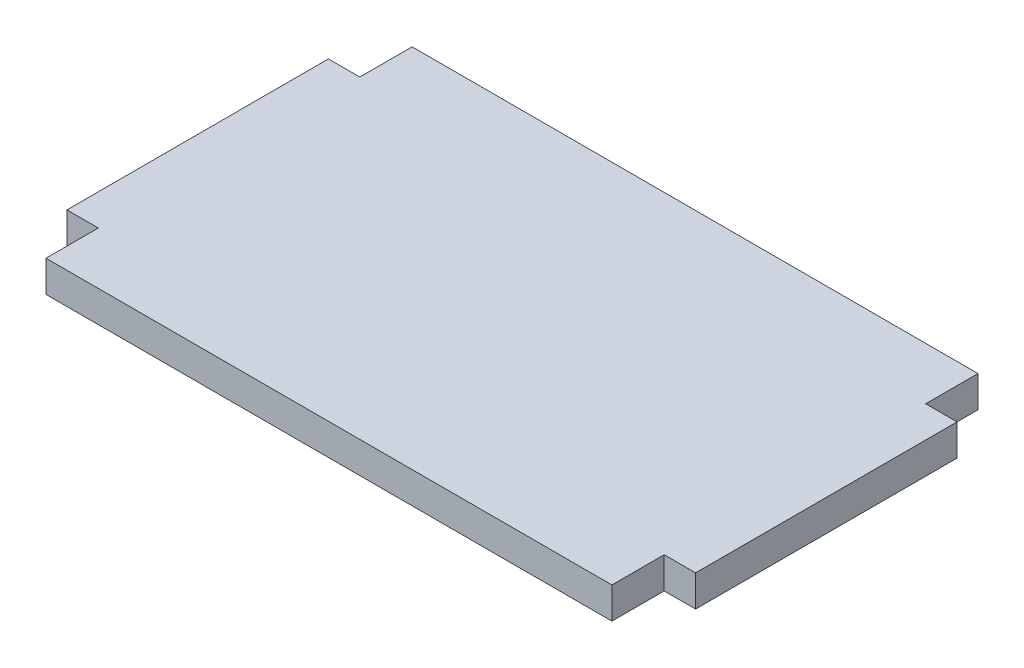
ISO-10303-21;
HEADER;
FILE_DESCRIPTION(('STEP AP214'),'2;1');
FILE_NAME('part.step','',(''),(''),'','','');
FILE_SCHEMA(('AUTOMOTIVE_DESIGN { 1 0 10303 214 1 1 1 1 }'));
ENDSEC;
DATA;
#1=APPLICATION_CONTEXT('core data for automotive mechanical design processes');
#2=APPLICATION_PROTOCOL_DEFINITION('international standard','automotive_design',2000,#1);
#3=PRODUCT_CONTEXT('',#1,'mechanical');
#4=PRODUCT('Part','Part','',(#3));
#5=PRODUCT_RELATED_PRODUCT_CATEGORY('part','',(#4));
#6=PRODUCT_DEFINITION_FORMATION('','',#4);
#7=PRODUCT_DEFINITION_CONTEXT('part definition',#1,'design');
#8=PRODUCT_DEFINITION('design','',#6,#7);
#9=PRODUCT_DEFINITION_SHAPE('','',#8);
#10=(LENGTH_UNIT() NAMED_UNIT(*) SI_UNIT(.MILLI.,.METRE.));
#11=(NAMED_UNIT(*) PLANE_ANGLE_UNIT() SI_UNIT($,.RADIAN.));
#12=(NAMED_UNIT(*) SI_UNIT($,.STERADIAN.) SOLID_ANGLE_UNIT());
#13=UNCERTAINTY_MEASURE_WITH_UNIT(LENGTH_MEASURE(1.E-05),#10,'distance_accuracy_value','');
#14=(GEOMETRIC_REPRESENTATION_CONTEXT(3) GLOBAL_UNCERTAINTY_ASSIGNED_CONTEXT((#13)) GLOBAL_UNIT_ASSIGNED_CONTEXT((#10,
#11,#12)) REPRESENTATION_CONTEXT('',''));
#15=CARTESIAN_POINT('',(0.,0.,0.));
#16=DIRECTION('',(0.,0.,1.));
#17=DIRECTION('',(1.,0.,0.));
#18=AXIS2_PLACEMENT_3D('',#15,#16,#17);
#19=CARTESIAN_POINT('',(0.,6.,0.));
#20=DIRECTION('',(0.,0.,-1.));
#21=DIRECTION('',(-1.,0.,0.));
#22=AXIS2_PLACEMENT_3D('',#19,#20,#21);
#23=PLANE('',#22);
#24=DIRECTION('',(0.,-1.,0.));
#25=VECTOR('',#24,1.);
#26=CARTESIAN_POINT('',(0.,6.,0.));
#27=LINE('',#26,#25);
#28=CARTESIAN_POINT('',(0.,6.,0.));
#29=VERTEX_POINT('',#28);
#30=CARTESIAN_POINT('',(0.,0.,0.));
#31=VERTEX_POINT('',#30);
#32=EDGE_CURVE('E59',#29,#31,#27,.T.);
#33=ORIENTED_EDGE('',*,*,#32,.F.);
#34=DIRECTION('',(1.,0.,0.));
#35=VECTOR('',#34,1.);
#36=CARTESIAN_POINT('',(0.,6.,0.));
#37=LINE('',#36,#35);
#38=CARTESIAN_POINT('',(-6.,6.,0.));
#39=VERTEX_POINT('',#38);
#40=EDGE_CURVE('E226',#39,#29,#37,.T.);
#41=ORIENTED_EDGE('',*,*,#40,.F.);
#42=DIRECTION('',(0.,1.,0.));
#43=VECTOR('',#42,1.);
#44=CARTESIAN_POINT('',(-6.,6.,0.));
#45=LINE('',#44,#43);
#46=CARTESIAN_POINT('',(-6.,0.,0.));
#47=VERTEX_POINT('',#46);
#48=EDGE_CURVE('E220',#47,#39,#45,.T.);
#49=ORIENTED_EDGE('',*,*,#48,.F.);
#50=DIRECTION('',(1.,0.,0.));
#51=VECTOR('',#50,1.);
#52=CARTESIAN_POINT('',(0.,0.,0.));
#53=LINE('',#52,#51);
#54=EDGE_CURVE('E204',#47,#31,#53,.T.);
#55=ORIENTED_EDGE('',*,*,#54,.T.);
#56=EDGE_LOOP('',(#33,#41,#49,#55));
#57=FACE_BOUND('',#56,.T.);
#58=ADVANCED_FACE('F42',(#57),#23,.F.);
#59=DIRECTION('',(0.,1.,0.));
#60=VECTOR('',#59,1.);
#61=CARTESIAN_POINT('',(108.2,6.,0.));
#62=LINE('',#61,#60);
#63=CARTESIAN_POINT('',(108.2,0.,0.));
#64=VERTEX_POINT('',#63);
#65=CARTESIAN_POINT('',(108.2,6.,0.));
#66=VERTEX_POINT('',#65);
#67=EDGE_CURVE('E67',#64,#66,#62,.T.);
#68=ORIENTED_EDGE('',*,*,#67,.F.);
#69=CARTESIAN_POINT('',(114.2,0.,0.));
#70=VERTEX_POINT('',#69);
#71=EDGE_CURVE('E208',#64,#70,#53,.T.);
#72=ORIENTED_EDGE('',*,*,#71,.T.);
#73=DIRECTION('',(0.,-1.,0.));
#74=VECTOR('',#73,1.);
#75=CARTESIAN_POINT('',(114.2,6.,0.));
#76=LINE('',#75,#74);
#77=CARTESIAN_POINT('',(114.2,6.,0.));
#78=VERTEX_POINT('',#77);
#79=EDGE_CURVE('E189',#78,#70,#76,.T.);
#80=ORIENTED_EDGE('',*,*,#79,.F.);
#81=EDGE_CURVE('E227',#66,#78,#37,.T.);
#82=ORIENTED_EDGE('',*,*,#81,.F.);
#83=EDGE_LOOP('',(#68,#72,#80,#82));
#84=FACE_BOUND('',#83,.T.);
#85=ADVANCED_FACE('F276',(#84),#23,.F.);
#86=CARTESIAN_POINT('',(0.,6.,-50.));
#87=DIRECTION('',(0.,0.,1.));
#88=DIRECTION('',(1.,0.,0.));
#89=AXIS2_PLACEMENT_3D('',#86,#87,#88);
#90=PLANE('',#89);
#91=DIRECTION('',(0.,-1.,0.));
#92=VECTOR('',#91,1.);
#93=CARTESIAN_POINT('',(108.2,6.,-50.));
#94=LINE('',#93,#92);
#95=CARTESIAN_POINT('',(108.2,6.,-50.));
#96=VERTEX_POINT('',#95);
#97=CARTESIAN_POINT('',(108.2,0.,-50.));
#98=VERTEX_POINT('',#97);
#99=EDGE_CURVE('E156',#96,#98,#94,.T.);
#100=ORIENTED_EDGE('',*,*,#99,.F.);
#101=DIRECTION('',(-1.,0.,0.));
#102=VECTOR('',#101,1.);
#103=CARTESIAN_POINT('',(0.,6.,-50.));
#104=LINE('',#103,#102);
#105=CARTESIAN_POINT('',(114.2,6.,-50.));
#106=VERTEX_POINT('',#105);
#107=EDGE_CURVE('E12',#106,#96,#104,.T.);
#108=ORIENTED_EDGE('',*,*,#107,.F.);
#109=DIRECTION('',(0.,1.,0.));
#110=VECTOR('',#109,1.);
#111=CARTESIAN_POINT('',(114.2,6.,-50.));
#112=LINE('',#111,#110);
#113=CARTESIAN_POINT('',(114.2,0.,-50.));
#114=VERTEX_POINT('',#113);
#115=EDGE_CURVE('E200',#114,#106,#112,.T.);
#116=ORIENTED_EDGE('',*,*,#115,.F.);
#117=DIRECTION('',(-1.,0.,0.));
#118=VECTOR('',#117,1.);
#119=CARTESIAN_POINT('',(0.,0.,-50.));
#120=LINE('',#119,#118);
#121=EDGE_CURVE('E45',#114,#98,#120,.T.);
#122=ORIENTED_EDGE('',*,*,#121,.T.);
#123=EDGE_LOOP('',(#100,#108,#116,#122));
#124=FACE_BOUND('',#123,.T.);
#125=ADVANCED_FACE('F300',(#124),#90,.F.);
#126=DIRECTION('',(0.,1.,0.));
#127=VECTOR('',#126,1.);
#128=CARTESIAN_POINT('',(0.,6.,-50.));
#129=LINE('',#128,#127);
#130=CARTESIAN_POINT('',(0.,0.,-50.));
#131=VERTEX_POINT('',#130);
#132=CARTESIAN_POINT('',(0.,6.,-50.));
#133=VERTEX_POINT('',#132);
#134=EDGE_CURVE('E158',#131,#133,#129,.T.);
#135=ORIENTED_EDGE('',*,*,#134,.F.);
#136=CARTESIAN_POINT('',(-6.,0.,-50.));
#137=VERTEX_POINT('',#136);
#138=EDGE_CURVE('E207',#131,#137,#120,.T.);
#139=ORIENTED_EDGE('',*,*,#138,.T.);
#140=DIRECTION('',(0.,-1.,0.));
#141=VECTOR('',#140,1.);
#142=CARTESIAN_POINT('',(-6.,6.,-50.));
#143=LINE('',#142,#141);
#144=CARTESIAN_POINT('',(-6.,6.,-50.));
#145=VERTEX_POINT('',#144);
#146=EDGE_CURVE('E221',#145,#137,#143,.T.);
#147=ORIENTED_EDGE('',*,*,#146,.F.);
#148=EDGE_CURVE('E51',#133,#145,#104,.T.);
#149=ORIENTED_EDGE('',*,*,#148,.F.);
#150=EDGE_LOOP('',(#135,#139,#147,#149));
#151=FACE_BOUND('',#150,.T.);
#152=ADVANCED_FACE('F242',(#151),#90,.F.);
#153=CARTESIAN_POINT('',(0.,6.,0.));
#154=DIRECTION('',(0.,-1.,0.));
#155=DIRECTION('',(0.,0.,-1.));
#156=AXIS2_PLACEMENT_3D('',#153,#154,#155);
#157=PLANE('',#156);
#158=ORIENTED_EDGE('',*,*,#107,.T.);
#159=DIRECTION('',(0.,0.,1.));
#160=VECTOR('',#159,1.);
#161=CARTESIAN_POINT('',(108.2,6.,-60.));
#162=LINE('',#161,#160);
#163=CARTESIAN_POINT('',(108.2,6.,-60.));
#164=VERTEX_POINT('',#163);
#165=EDGE_CURVE('E260',#164,#96,#162,.T.);
#166=ORIENTED_EDGE('',*,*,#165,.F.);
#167=DIRECTION('',(1.,0.,0.));
#168=VECTOR('',#167,1.);
#169=CARTESIAN_POINT('',(108.2,6.,-60.));
#170=LINE('',#169,#168);
#171=CARTESIAN_POINT('',(0.,6.,-60.));
#172=VERTEX_POINT('',#171);
#173=EDGE_CURVE('E266',#172,#164,#170,.T.);
#174=ORIENTED_EDGE('',*,*,#173,.F.);
#175=DIRECTION('',(0.,0.,1.));
#176=VECTOR('',#175,1.);
#177=CARTESIAN_POINT('',(0.,6.,-60.));
#178=LINE('',#177,#176);
#179=EDGE_CURVE('E265',#172,#133,#178,.T.);
#180=ORIENTED_EDGE('',*,*,#179,.T.);
#181=ORIENTED_EDGE('',*,*,#148,.T.);
#182=DIRECTION('',(0.,0.,-1.));
#183=VECTOR('',#182,1.);
#184=CARTESIAN_POINT('',(-6.,6.,-50.));
#185=LINE('',#184,#183);
#186=EDGE_CURVE('E224',#39,#145,#185,.T.);
#187=ORIENTED_EDGE('',*,*,#186,.F.);
#188=ORIENTED_EDGE('',*,*,#40,.T.);
#189=DIRECTION('',(0.,0.,-1.));
#190=VECTOR('',#189,1.);
#191=CARTESIAN_POINT('',(0.,6.,10.));
#192=LINE('',#191,#190);
#193=CARTESIAN_POINT('',(0.,6.,10.));
#194=VERTEX_POINT('',#193);
#195=EDGE_CURVE('E282',#194,#29,#192,.T.);
#196=ORIENTED_EDGE('',*,*,#195,.F.);
#197=DIRECTION('',(-1.,0.,0.));
#198=VECTOR('',#197,1.);
#199=CARTESIAN_POINT('',(0.,6.,10.));
#200=LINE('',#199,#198);
#201=CARTESIAN_POINT('',(108.2,6.,10.));
#202=VERTEX_POINT('',#201);
#203=EDGE_CURVE('E149',#202,#194,#200,.T.);
#204=ORIENTED_EDGE('',*,*,#203,.F.);
#205=DIRECTION('',(0.,0.,-1.));
#206=VECTOR('',#205,1.);
#207=CARTESIAN_POINT('',(108.2,6.,10.));
#208=LINE('',#207,#206);
#209=EDGE_CURVE('E161',#202,#66,#208,.T.);
#210=ORIENTED_EDGE('',*,*,#209,.T.);
#211=ORIENTED_EDGE('',*,*,#81,.T.);
#212=DIRECTION('',(0.,0.,1.));
#213=VECTOR('',#212,1.);
#214=CARTESIAN_POINT('',(114.2,6.,0.));
#215=LINE('',#214,#213);
#216=EDGE_CURVE('E250',#106,#78,#215,.T.);
#217=ORIENTED_EDGE('',*,*,#216,.F.);
#218=EDGE_LOOP('',(#158,#166,#174,#180,#181,#187,#188,#196,#204,#210,#211,#217));
#219=FACE_BOUND('',#218,.T.);
#220=ADVANCED_FACE('F256',(#219),#157,.F.);
#221=CARTESIAN_POINT('',(0.,0.,0.));
#222=DIRECTION('',(0.,-1.,0.));
#223=DIRECTION('',(0.,0.,-1.));
#224=AXIS2_PLACEMENT_3D('',#221,#222,#223);
#225=PLANE('',#224);
#226=ORIENTED_EDGE('',*,*,#54,.F.);
#227=DIRECTION('',(0.,0.,1.));
#228=VECTOR('',#227,1.);
#229=CARTESIAN_POINT('',(-6.,0.,-50.));
#230=LINE('',#229,#228);
#231=EDGE_CURVE('E214',#137,#47,#230,.T.);
#232=ORIENTED_EDGE('',*,*,#231,.F.);
#233=ORIENTED_EDGE('',*,*,#138,.F.);
#234=DIRECTION('',(0.,0.,1.));
#235=VECTOR('',#234,1.);
#236=CARTESIAN_POINT('',(0.,0.,-60.));
#237=LINE('',#236,#235);
#238=CARTESIAN_POINT('',(0.,0.,-60.));
#239=VERTEX_POINT('',#238);
#240=EDGE_CURVE('E190',#239,#131,#237,.T.);
#241=ORIENTED_EDGE('',*,*,#240,.F.);
#242=DIRECTION('',(-1.,0.,0.));
#243=VECTOR('',#242,1.);
#244=CARTESIAN_POINT('',(108.2,0.,-60.));
#245=LINE('',#244,#243);
#246=CARTESIAN_POINT('',(108.2,0.,-60.));
#247=VERTEX_POINT('',#246);
#248=EDGE_CURVE('E170',#247,#239,#245,.T.);
#249=ORIENTED_EDGE('',*,*,#248,.F.);
#250=DIRECTION('',(0.,0.,1.));
#251=VECTOR('',#250,1.);
#252=CARTESIAN_POINT('',(108.2,0.,-60.));
#253=LINE('',#252,#251);
#254=EDGE_CURVE('E184',#247,#98,#253,.T.);
#255=ORIENTED_EDGE('',*,*,#254,.T.);
#256=ORIENTED_EDGE('',*,*,#121,.F.);
#257=DIRECTION('',(0.,0.,-1.));
#258=VECTOR('',#257,1.);
#259=CARTESIAN_POINT('',(114.2,0.,0.));
#260=LINE('',#259,#258);
#261=EDGE_CURVE('E195',#70,#114,#260,.T.);
#262=ORIENTED_EDGE('',*,*,#261,.F.);
#263=ORIENTED_EDGE('',*,*,#71,.F.);
#264=DIRECTION('',(0.,0.,-1.));
#265=VECTOR('',#264,1.);
#266=CARTESIAN_POINT('',(108.2,0.,10.));
#267=LINE('',#266,#265);
#268=CARTESIAN_POINT('',(108.2,0.,10.));
#269=VERTEX_POINT('',#268);
#270=EDGE_CURVE('E139',#269,#64,#267,.T.);
#271=ORIENTED_EDGE('',*,*,#270,.F.);
#272=DIRECTION('',(1.,0.,0.));
#273=VECTOR('',#272,1.);
#274=CARTESIAN_POINT('',(0.,0.,10.));
#275=LINE('',#274,#273);
#276=CARTESIAN_POINT('',(0.,0.,10.));
#277=VERTEX_POINT('',#276);
#278=EDGE_CURVE('E133',#277,#269,#275,.T.);
#279=ORIENTED_EDGE('',*,*,#278,.F.);
#280=DIRECTION('',(0.,0.,-1.));
#281=VECTOR('',#280,1.);
#282=CARTESIAN_POINT('',(0.,0.,10.));
#283=LINE('',#282,#281);
#284=EDGE_CURVE('E137',#277,#31,#283,.T.);
#285=ORIENTED_EDGE('',*,*,#284,.T.);
#286=EDGE_LOOP('',(#226,#232,#233,#241,#249,#255,#256,#262,#263,#271,#279,#285));
#287=FACE_BOUND('',#286,.T.);
#288=ADVANCED_FACE('F135',(#287),#225,.T.);
#289=CARTESIAN_POINT('',(-6.,0.,0.));
#290=DIRECTION('',(-1.,0.,0.));
#291=DIRECTION('',(0.,0.,1.));
#292=AXIS2_PLACEMENT_3D('',#289,#290,#291);
#293=PLANE('',#292);
#294=ORIENTED_EDGE('',*,*,#146,.T.);
#295=ORIENTED_EDGE('',*,*,#231,.T.);
#296=ORIENTED_EDGE('',*,*,#48,.T.);
#297=ORIENTED_EDGE('',*,*,#186,.T.);
#298=EDGE_LOOP('',(#294,#295,#296,#297));
#299=FACE_BOUND('',#298,.T.);
#300=ADVANCED_FACE('F249',(#299),#293,.T.);
#301=CARTESIAN_POINT('',(114.2,0.,0.));
#302=DIRECTION('',(1.,0.,0.));
#303=DIRECTION('',(0.,0.,-1.));
#304=AXIS2_PLACEMENT_3D('',#301,#302,#303);
#305=PLANE('',#304);
#306=ORIENTED_EDGE('',*,*,#79,.T.);
#307=ORIENTED_EDGE('',*,*,#261,.T.);
#308=ORIENTED_EDGE('',*,*,#115,.T.);
#309=ORIENTED_EDGE('',*,*,#216,.T.);
#310=EDGE_LOOP('',(#306,#307,#308,#309));
#311=FACE_BOUND('',#310,.T.);
#312=ADVANCED_FACE('F254',(#311),#305,.T.);
#313=CARTESIAN_POINT('',(108.2,6.,-60.));
#314=DIRECTION('',(-1.,0.,0.));
#315=DIRECTION('',(0.,0.,1.));
#316=AXIS2_PLACEMENT_3D('',#313,#314,#315);
#317=PLANE('',#316);
#318=ORIENTED_EDGE('',*,*,#99,.T.);
#319=ORIENTED_EDGE('',*,*,#254,.F.);
#320=DIRECTION('',(0.,-1.,0.));
#321=VECTOR('',#320,1.);
#322=CARTESIAN_POINT('',(108.2,6.,-60.));
#323=LINE('',#322,#321);
#324=EDGE_CURVE('E167',#164,#247,#323,.T.);
#325=ORIENTED_EDGE('',*,*,#324,.F.);
#326=ORIENTED_EDGE('',*,*,#165,.T.);
#327=EDGE_LOOP('',(#318,#319,#325,#326));
#328=FACE_BOUND('',#327,.T.);
#329=ADVANCED_FACE('F263',(#328),#317,.F.);
#330=CARTESIAN_POINT('',(0.,6.,-60.));
#331=DIRECTION('',(1.,0.,0.));
#332=DIRECTION('',(0.,0.,-1.));
#333=AXIS2_PLACEMENT_3D('',#330,#331,#332);
#334=PLANE('',#333);
#335=ORIENTED_EDGE('',*,*,#134,.T.);
#336=ORIENTED_EDGE('',*,*,#179,.F.);
#337=DIRECTION('',(0.,1.,0.));
#338=VECTOR('',#337,1.);
#339=CARTESIAN_POINT('',(0.,6.,-60.));
#340=LINE('',#339,#338);
#341=EDGE_CURVE('E174',#239,#172,#340,.T.);
#342=ORIENTED_EDGE('',*,*,#341,.F.);
#343=ORIENTED_EDGE('',*,*,#240,.T.);
#344=EDGE_LOOP('',(#335,#336,#342,#343));
#345=FACE_BOUND('',#344,.T.);
#346=ADVANCED_FACE('F272',(#345),#334,.F.);
#347=CARTESIAN_POINT('',(0.,0.,-60.));
#348=DIRECTION('',(0.,0.,-1.));
#349=DIRECTION('',(-1.,0.,0.));
#350=AXIS2_PLACEMENT_3D('',#347,#348,#349);
#351=PLANE('',#350);
#352=ORIENTED_EDGE('',*,*,#324,.T.);
#353=ORIENTED_EDGE('',*,*,#248,.T.);
#354=ORIENTED_EDGE('',*,*,#341,.T.);
#355=ORIENTED_EDGE('',*,*,#173,.T.);
#356=EDGE_LOOP('',(#352,#353,#354,#355));
#357=FACE_BOUND('',#356,.T.);
#358=ADVANCED_FACE('F275',(#357),#351,.T.);
#359=CARTESIAN_POINT('',(0.,6.,10.));
#360=DIRECTION('',(1.,0.,0.));
#361=DIRECTION('',(0.,1.,0.));
#362=AXIS2_PLACEMENT_3D('',#359,#360,#361);
#363=PLANE('',#362);
#364=ORIENTED_EDGE('',*,*,#32,.T.);
#365=ORIENTED_EDGE('',*,*,#284,.F.);
#366=DIRECTION('',(0.,-1.,0.));
#367=VECTOR('',#366,1.);
#368=CARTESIAN_POINT('',(0.,6.,10.));
#369=LINE('',#368,#367);
#370=EDGE_CURVE('E144',#194,#277,#369,.T.);
#371=ORIENTED_EDGE('',*,*,#370,.F.);
#372=ORIENTED_EDGE('',*,*,#195,.T.);
#373=EDGE_LOOP('',(#364,#365,#371,#372));
#374=FACE_BOUND('',#373,.T.);
#375=ADVANCED_FACE('F154',(#374),#363,.F.);
#376=CARTESIAN_POINT('',(108.2,6.,10.));
#377=DIRECTION('',(-1.,0.,0.));
#378=DIRECTION('',(0.,0.,1.));
#379=AXIS2_PLACEMENT_3D('',#376,#377,#378);
#380=PLANE('',#379);
#381=ORIENTED_EDGE('',*,*,#67,.T.);
#382=ORIENTED_EDGE('',*,*,#209,.F.);
#383=DIRECTION('',(0.,1.,0.));
#384=VECTOR('',#383,1.);
#385=CARTESIAN_POINT('',(108.2,6.,10.));
#386=LINE('',#385,#384);
#387=EDGE_CURVE('E143',#269,#202,#386,.T.);
#388=ORIENTED_EDGE('',*,*,#387,.F.);
#389=ORIENTED_EDGE('',*,*,#270,.T.);
#390=EDGE_LOOP('',(#381,#382,#388,#389));
#391=FACE_BOUND('',#390,.T.);
#392=ADVANCED_FACE('F280',(#391),#380,.F.);
#393=CARTESIAN_POINT('',(0.,0.,10.));
#394=DIRECTION('',(0.,0.,1.));
#395=DIRECTION('',(1.,0.,0.));
#396=AXIS2_PLACEMENT_3D('',#393,#394,#395);
#397=PLANE('',#396);
#398=ORIENTED_EDGE('',*,*,#370,.T.);
#399=ORIENTED_EDGE('',*,*,#278,.T.);
#400=ORIENTED_EDGE('',*,*,#387,.T.);
#401=ORIENTED_EDGE('',*,*,#203,.T.);
#402=EDGE_LOOP('',(#398,#399,#400,#401));
#403=FACE_BOUND('',#402,.T.);
#404=ADVANCED_FACE('F147',(#403),#397,.T.);
#405=CLOSED_SHELL('',(#58,#85,#125,#152,#220,#288,#300,#312,#329,#346,#358,#375,#392,#404));
#406=MANIFOLD_SOLID_BREP('B2',#405);
#407=ADVANCED_BREP_SHAPE_REPRESENTATION('',(#18,#406),#14);
#408=SHAPE_DEFINITION_REPRESENTATION(#9,#407);
ENDSEC;
END-ISO-10303-21;
